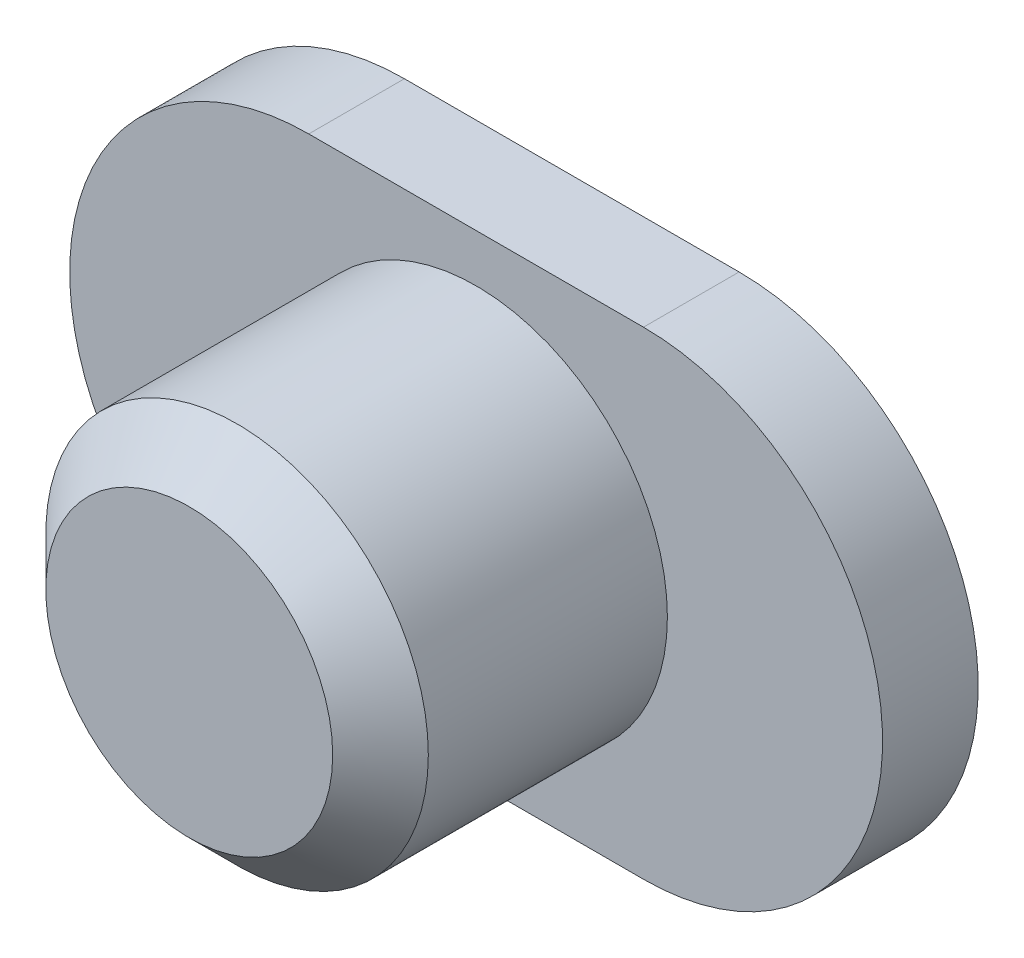
ISO-10303-21;
HEADER;
FILE_DESCRIPTION(('STEP AP214'),'2;1');
FILE_NAME('part.step','',(''),(''),'','','');
FILE_SCHEMA(('AUTOMOTIVE_DESIGN { 1 0 10303 214 1 1 1 1 }'));
ENDSEC;
DATA;
#1=APPLICATION_CONTEXT('core data for automotive mechanical design processes');
#2=APPLICATION_PROTOCOL_DEFINITION('international standard','automotive_design',2000,#1);
#3=PRODUCT_CONTEXT('',#1,'mechanical');
#4=PRODUCT('Part','Part','',(#3));
#5=PRODUCT_RELATED_PRODUCT_CATEGORY('part','',(#4));
#6=PRODUCT_DEFINITION_FORMATION('','',#4);
#7=PRODUCT_DEFINITION_CONTEXT('part definition',#1,'design');
#8=PRODUCT_DEFINITION('design','',#6,#7);
#9=PRODUCT_DEFINITION_SHAPE('','',#8);
#10=(LENGTH_UNIT() NAMED_UNIT(*) SI_UNIT(.MILLI.,.METRE.));
#11=(NAMED_UNIT(*) PLANE_ANGLE_UNIT() SI_UNIT($,.RADIAN.));
#12=(NAMED_UNIT(*) SI_UNIT($,.STERADIAN.) SOLID_ANGLE_UNIT());
#13=UNCERTAINTY_MEASURE_WITH_UNIT(LENGTH_MEASURE(1.E-05),#10,'distance_accuracy_value','');
#14=(GEOMETRIC_REPRESENTATION_CONTEXT(3) GLOBAL_UNCERTAINTY_ASSIGNED_CONTEXT((#13)) GLOBAL_UNIT_ASSIGNED_CONTEXT((#10,
#11,#12)) REPRESENTATION_CONTEXT('',''));
#15=CARTESIAN_POINT('',(0.,0.,0.));
#16=DIRECTION('',(0.,0.,1.));
#17=DIRECTION('',(1.,0.,0.));
#18=AXIS2_PLACEMENT_3D('',#15,#16,#17);
#19=CARTESIAN_POINT('',(-3.5,0.,2.));
#20=DIRECTION('',(0.,0.,1.));
#21=DIRECTION('',(1.,0.,0.));
#22=AXIS2_PLACEMENT_3D('',#19,#20,#21);
#23=PLANE('',#22);
#24=CARTESIAN_POINT('',(-3.5,0.,2.));
#25=DIRECTION('',(0.,0.,1.));
#26=DIRECTION('',(1.,0.,0.));
#27=AXIS2_PLACEMENT_3D('',#24,#25,#26);
#28=CIRCLE('',#27,5.);
#29=CARTESIAN_POINT('',(-3.5,5.,2.));
#30=VERTEX_POINT('',#29);
#31=CARTESIAN_POINT('',(-3.5,-5.,2.));
#32=VERTEX_POINT('',#31);
#33=EDGE_CURVE('E90',#30,#32,#28,.T.);
#34=ORIENTED_EDGE('',*,*,#33,.T.);
#35=DIRECTION('',(1.,0.,0.));
#36=VECTOR('',#35,1.);
#37=CARTESIAN_POINT('',(-3.5,-5.,2.));
#38=LINE('',#37,#36);
#39=CARTESIAN_POINT('',(3.5,-5.,2.));
#40=VERTEX_POINT('',#39);
#41=EDGE_CURVE('E85',#32,#40,#38,.T.);
#42=ORIENTED_EDGE('',*,*,#41,.T.);
#43=CARTESIAN_POINT('',(3.5,0.,2.));
#44=DIRECTION('',(0.,0.,1.));
#45=DIRECTION('',(1.,0.,0.));
#46=AXIS2_PLACEMENT_3D('',#43,#44,#45);
#47=CIRCLE('',#46,5.);
#48=CARTESIAN_POINT('',(3.5,5.,2.));
#49=VERTEX_POINT('',#48);
#50=EDGE_CURVE('E88',#40,#49,#47,.T.);
#51=ORIENTED_EDGE('',*,*,#50,.T.);
#52=DIRECTION('',(-1.,0.,0.));
#53=VECTOR('',#52,1.);
#54=CARTESIAN_POINT('',(-3.5,5.,2.));
#55=LINE('',#54,#53);
#56=EDGE_CURVE('E54',#49,#30,#55,.T.);
#57=ORIENTED_EDGE('',*,*,#56,.T.);
#58=EDGE_LOOP('',(#34,#42,#51,#57));
#59=FACE_BOUND('',#58,.T.);
#60=CARTESIAN_POINT('',(0.,0.,2.));
#61=DIRECTION('',(0.,0.,1.));
#62=DIRECTION('',(1.,0.,0.));
#63=AXIS2_PLACEMENT_3D('',#60,#61,#62);
#64=CIRCLE('',#63,4.);
#65=CARTESIAN_POINT('',(4.,0.,2.));
#66=VERTEX_POINT('',#65);
#67=EDGE_CURVE('E108',#66,#66,#64,.T.);
#68=ORIENTED_EDGE('',*,*,#67,.F.);
#69=EDGE_LOOP('',(#68));
#70=FACE_BOUND('',#69,.T.);
#71=ADVANCED_FACE('F37',(#59,#70),#23,.T.);
#72=CARTESIAN_POINT('',(-3.5,0.,2.));
#73=DIRECTION('',(0.,0.,-1.));
#74=DIRECTION('',(-1.,0.,0.));
#75=AXIS2_PLACEMENT_3D('',#72,#73,#74);
#76=CYLINDRICAL_SURFACE('',#75,5.);
#77=CARTESIAN_POINT('',(-3.5,0.,0.));
#78=DIRECTION('',(0.,0.,1.));
#79=DIRECTION('',(1.,0.,0.));
#80=AXIS2_PLACEMENT_3D('',#77,#78,#79);
#81=CIRCLE('',#80,5.);
#82=CARTESIAN_POINT('',(-3.5,5.,0.));
#83=VERTEX_POINT('',#82);
#84=CARTESIAN_POINT('',(-3.5,-5.,0.));
#85=VERTEX_POINT('',#84);
#86=EDGE_CURVE('E105',#83,#85,#81,.T.);
#87=ORIENTED_EDGE('',*,*,#86,.T.);
#88=DIRECTION('',(0.,0.,-1.));
#89=VECTOR('',#88,1.);
#90=CARTESIAN_POINT('',(-3.5,-5.,2.));
#91=LINE('',#90,#89);
#92=EDGE_CURVE('E96',#32,#85,#91,.T.);
#93=ORIENTED_EDGE('',*,*,#92,.F.);
#94=ORIENTED_EDGE('',*,*,#33,.F.);
#95=DIRECTION('',(0.,0.,-1.));
#96=VECTOR('',#95,1.);
#97=CARTESIAN_POINT('',(-3.5,5.,2.));
#98=LINE('',#97,#96);
#99=EDGE_CURVE('E101',#30,#83,#98,.T.);
#100=ORIENTED_EDGE('',*,*,#99,.T.);
#101=EDGE_LOOP('',(#87,#93,#94,#100));
#102=FACE_BOUND('',#101,.T.);
#103=ADVANCED_FACE('F130',(#102),#76,.T.);
#104=CARTESIAN_POINT('',(-3.5,-5.,2.));
#105=DIRECTION('',(0.,1.,0.));
#106=DIRECTION('',(-1.,0.,0.));
#107=AXIS2_PLACEMENT_3D('',#104,#105,#106);
#108=PLANE('',#107);
#109=DIRECTION('',(1.,0.,0.));
#110=VECTOR('',#109,1.);
#111=CARTESIAN_POINT('',(-3.5,-5.,0.));
#112=LINE('',#111,#110);
#113=CARTESIAN_POINT('',(3.5,-5.,0.));
#114=VERTEX_POINT('',#113);
#115=EDGE_CURVE('E95',#85,#114,#112,.T.);
#116=ORIENTED_EDGE('',*,*,#115,.T.);
#117=DIRECTION('',(0.,0.,-1.));
#118=VECTOR('',#117,1.);
#119=CARTESIAN_POINT('',(3.5,-5.,2.));
#120=LINE('',#119,#118);
#121=EDGE_CURVE('E93',#40,#114,#120,.T.);
#122=ORIENTED_EDGE('',*,*,#121,.F.);
#123=ORIENTED_EDGE('',*,*,#41,.F.);
#124=ORIENTED_EDGE('',*,*,#92,.T.);
#125=EDGE_LOOP('',(#116,#122,#123,#124));
#126=FACE_BOUND('',#125,.T.);
#127=ADVANCED_FACE('F94',(#126),#108,.F.);
#128=CARTESIAN_POINT('',(3.5,0.,2.));
#129=DIRECTION('',(0.,0.,-1.));
#130=DIRECTION('',(-1.,0.,0.));
#131=AXIS2_PLACEMENT_3D('',#128,#129,#130);
#132=CYLINDRICAL_SURFACE('',#131,5.);
#133=CARTESIAN_POINT('',(3.5,0.,0.));
#134=DIRECTION('',(0.,0.,1.));
#135=DIRECTION('',(1.,0.,0.));
#136=AXIS2_PLACEMENT_3D('',#133,#134,#135);
#137=CIRCLE('',#136,5.);
#138=CARTESIAN_POINT('',(3.5,5.,0.));
#139=VERTEX_POINT('',#138);
#140=EDGE_CURVE('E71',#114,#139,#137,.T.);
#141=ORIENTED_EDGE('',*,*,#140,.T.);
#142=DIRECTION('',(0.,0.,-1.));
#143=VECTOR('',#142,1.);
#144=CARTESIAN_POINT('',(3.5,5.,2.));
#145=LINE('',#144,#143);
#146=EDGE_CURVE('E97',#49,#139,#145,.T.);
#147=ORIENTED_EDGE('',*,*,#146,.F.);
#148=ORIENTED_EDGE('',*,*,#50,.F.);
#149=ORIENTED_EDGE('',*,*,#121,.T.);
#150=EDGE_LOOP('',(#141,#147,#148,#149));
#151=FACE_BOUND('',#150,.T.);
#152=ADVANCED_FACE('F99',(#151),#132,.T.);
#153=CARTESIAN_POINT('',(-3.5,5.,2.));
#154=DIRECTION('',(0.,-1.,0.));
#155=DIRECTION('',(1.,0.,0.));
#156=AXIS2_PLACEMENT_3D('',#153,#154,#155);
#157=PLANE('',#156);
#158=DIRECTION('',(-1.,0.,0.));
#159=VECTOR('',#158,1.);
#160=CARTESIAN_POINT('',(-3.5,5.,0.));
#161=LINE('',#160,#159);
#162=EDGE_CURVE('E77',#139,#83,#161,.T.);
#163=ORIENTED_EDGE('',*,*,#162,.T.);
#164=ORIENTED_EDGE('',*,*,#99,.F.);
#165=ORIENTED_EDGE('',*,*,#56,.F.);
#166=ORIENTED_EDGE('',*,*,#146,.T.);
#167=EDGE_LOOP('',(#163,#164,#165,#166));
#168=FACE_BOUND('',#167,.T.);
#169=ADVANCED_FACE('F143',(#168),#157,.F.);
#170=CARTESIAN_POINT('',(-3.5,0.,0.));
#171=DIRECTION('',(0.,0.,1.));
#172=DIRECTION('',(1.,0.,0.));
#173=AXIS2_PLACEMENT_3D('',#170,#171,#172);
#174=PLANE('',#173);
#175=CARTESIAN_POINT('',(0.,0.,0.));
#176=DIRECTION('',(0.,0.,-1.));
#177=DIRECTION('',(-1.,0.,0.));
#178=AXIS2_PLACEMENT_3D('',#175,#176,#177);
#179=CIRCLE('',#178,3.);
#180=CARTESIAN_POINT('',(-3.,0.,0.));
#181=VERTEX_POINT('',#180);
#182=EDGE_CURVE('E224',#181,#181,#179,.T.);
#183=ORIENTED_EDGE('',*,*,#182,.F.);
#184=EDGE_LOOP('',(#183));
#185=FACE_BOUND('',#184,.T.);
#186=ORIENTED_EDGE('',*,*,#86,.F.);
#187=ORIENTED_EDGE('',*,*,#162,.F.);
#188=ORIENTED_EDGE('',*,*,#140,.F.);
#189=ORIENTED_EDGE('',*,*,#115,.F.);
#190=EDGE_LOOP('',(#186,#187,#188,#189));
#191=FACE_BOUND('',#190,.T.);
#192=ADVANCED_FACE('F140',(#185,#191),#174,.F.);
#193=CARTESIAN_POINT('',(0.,0.,8.));
#194=DIRECTION('',(0.,0.,-1.));
#195=DIRECTION('',(-1.,0.,0.));
#196=AXIS2_PLACEMENT_3D('',#193,#194,#195);
#197=CYLINDRICAL_SURFACE('',#196,4.);
#198=CARTESIAN_POINT('',(0.,0.,7.));
#199=DIRECTION('',(0.,0.,1.));
#200=DIRECTION('',(1.,0.,0.));
#201=AXIS2_PLACEMENT_3D('',#198,#199,#200);
#202=CIRCLE('',#201,4.);
#203=CARTESIAN_POINT('',(4.,0.,7.));
#204=VERTEX_POINT('',#203);
#205=EDGE_CURVE('E11',#204,#204,#202,.F.);
#206=ORIENTED_EDGE('',*,*,#205,.T.);
#207=EDGE_LOOP('',(#206));
#208=FACE_BOUND('',#207,.T.);
#209=ORIENTED_EDGE('',*,*,#67,.T.);
#210=EDGE_LOOP('',(#209));
#211=FACE_BOUND('',#210,.T.);
#212=ADVANCED_FACE('F138',(#208,#211),#197,.T.);
#213=CARTESIAN_POINT('',(0.,0.,8.));
#214=DIRECTION('',(0.,0.,1.));
#215=DIRECTION('',(1.,0.,0.));
#216=AXIS2_PLACEMENT_3D('',#213,#214,#215);
#217=PLANE('',#216);
#218=CARTESIAN_POINT('',(0.,0.,8.));
#219=DIRECTION('',(0.,0.,1.));
#220=DIRECTION('',(1.,0.,0.));
#221=AXIS2_PLACEMENT_3D('',#218,#219,#220);
#222=CIRCLE('',#221,3.);
#223=CARTESIAN_POINT('',(3.,0.,8.));
#224=VERTEX_POINT('',#223);
#225=EDGE_CURVE('E46',#224,#224,#222,.T.);
#226=ORIENTED_EDGE('',*,*,#225,.T.);
#227=EDGE_LOOP('',(#226));
#228=FACE_BOUND('',#227,.T.);
#229=ADVANCED_FACE('F117',(#228),#217,.T.);
#230=CARTESIAN_POINT('',(0.,0.,4.));
#231=DIRECTION('',(0.,0.,-1.));
#232=DIRECTION('',(-1.,0.,0.));
#233=AXIS2_PLACEMENT_3D('',#230,#231,#232);
#234=CYLINDRICAL_SURFACE('',#233,3.);
#235=CARTESIAN_POINT('',(0.,0.,4.));
#236=DIRECTION('',(0.,0.,-1.));
#237=DIRECTION('',(-1.,0.,0.));
#238=AXIS2_PLACEMENT_3D('',#235,#236,#237);
#239=CIRCLE('',#238,3.);
#240=CARTESIAN_POINT('',(-3.,0.,4.));
#241=VERTEX_POINT('',#240);
#242=EDGE_CURVE('E221',#241,#241,#239,.T.);
#243=ORIENTED_EDGE('',*,*,#242,.F.);
#244=EDGE_LOOP('',(#243));
#245=FACE_BOUND('',#244,.T.);
#246=ORIENTED_EDGE('',*,*,#182,.T.);
#247=EDGE_LOOP('',(#246));
#248=FACE_BOUND('',#247,.T.);
#249=ADVANCED_FACE('F125',(#245,#248),#234,.F.);
#250=CARTESIAN_POINT('',(0.,0.,4.));
#251=DIRECTION('',(0.,0.,-1.));
#252=DIRECTION('',(-1.,0.,0.));
#253=AXIS2_PLACEMENT_3D('',#250,#251,#252);
#254=PLANE('',#253);
#255=ORIENTED_EDGE('',*,*,#242,.T.);
#256=EDGE_LOOP('',(#255));
#257=FACE_BOUND('',#256,.T.);
#258=ADVANCED_FACE('F120',(#257),#254,.T.);
#259=CARTESIAN_POINT('',(0.,0.,8.));
#260=DIRECTION('',(0.,0.,-1.));
#261=DIRECTION('',(-1.,0.,0.));
#262=AXIS2_PLACEMENT_3D('',#259,#260,#261);
#263=CONICAL_SURFACE('',#262,3.,0.785398163397447);
#264=ORIENTED_EDGE('',*,*,#205,.F.);
#265=EDGE_LOOP('',(#264));
#266=FACE_BOUND('',#265,.T.);
#267=ORIENTED_EDGE('',*,*,#225,.F.);
#268=EDGE_LOOP('',(#267));
#269=FACE_BOUND('',#268,.T.);
#270=ADVANCED_FACE('F39',(#266,#269),#263,.T.);
#271=CLOSED_SHELL('',(#71,#103,#127,#152,#169,#192,#212,#229,#249,#258,#270));
#272=MANIFOLD_SOLID_BREP('B2',#271);
#273=ADVANCED_BREP_SHAPE_REPRESENTATION('',(#18,#272),#14);
#274=SHAPE_DEFINITION_REPRESENTATION(#9,#273);
ENDSEC;
END-ISO-10303-21;
